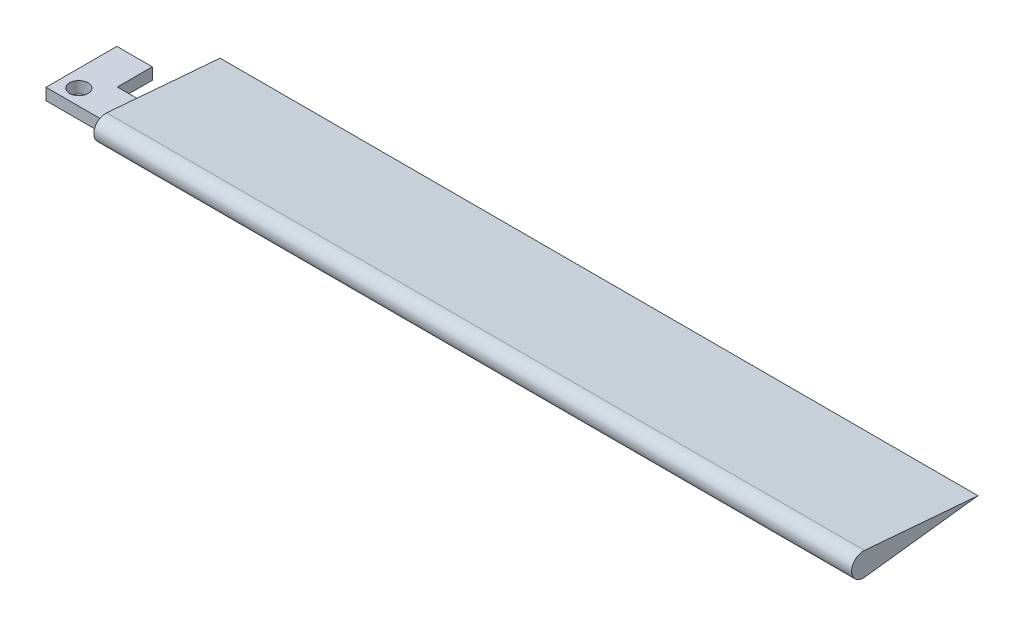
ISO-10303-21;
HEADER;
FILE_DESCRIPTION(('STEP AP214'),'2;1');
FILE_NAME('part.step','',(''),(''),'','','');
FILE_SCHEMA(('AUTOMOTIVE_DESIGN { 1 0 10303 214 1 1 1 1 }'));
ENDSEC;
DATA;
#1=APPLICATION_CONTEXT('core data for automotive mechanical design processes');
#2=APPLICATION_PROTOCOL_DEFINITION('international standard','automotive_design',2000,#1);
#3=PRODUCT_CONTEXT('',#1,'mechanical');
#4=PRODUCT('Part','Part','',(#3));
#5=PRODUCT_RELATED_PRODUCT_CATEGORY('part','',(#4));
#6=PRODUCT_DEFINITION_FORMATION('','',#4);
#7=PRODUCT_DEFINITION_CONTEXT('part definition',#1,'design');
#8=PRODUCT_DEFINITION('design','',#6,#7);
#9=PRODUCT_DEFINITION_SHAPE('','',#8);
#10=(LENGTH_UNIT() NAMED_UNIT(*) SI_UNIT(.MILLI.,.METRE.));
#11=(NAMED_UNIT(*) PLANE_ANGLE_UNIT() SI_UNIT($,.RADIAN.));
#12=(NAMED_UNIT(*) SI_UNIT($,.STERADIAN.) SOLID_ANGLE_UNIT());
#13=UNCERTAINTY_MEASURE_WITH_UNIT(LENGTH_MEASURE(1.E-05),#10,'distance_accuracy_value','');
#14=(GEOMETRIC_REPRESENTATION_CONTEXT(3) GLOBAL_UNCERTAINTY_ASSIGNED_CONTEXT((#13)) GLOBAL_UNIT_ASSIGNED_CONTEXT((#10,
#11,#12)) REPRESENTATION_CONTEXT('',''));
#15=CARTESIAN_POINT('',(0.,0.,0.));
#16=DIRECTION('',(0.,0.,1.));
#17=DIRECTION('',(1.,0.,0.));
#18=AXIS2_PLACEMENT_3D('',#15,#16,#17);
#19=CARTESIAN_POINT('',(-10.,2.21074085443305,14.5472498082597));
#20=DIRECTION('',(0.,0.,1.));
#21=DIRECTION('',(1.,0.,0.));
#22=AXIS2_PLACEMENT_3D('',#19,#20,#21);
#23=PLANE('',#22);
#24=DIRECTION('',(0.,-1.,0.));
#25=VECTOR('',#24,1.);
#26=CARTESIAN_POINT('',(-3.92233865415842,2.21074085443305,14.5472498082597));
#27=LINE('',#26,#25);
#28=CARTESIAN_POINT('',(-3.92233865415842,2.21074085443305,14.5472498082597));
#29=VERTEX_POINT('',#28);
#30=CARTESIAN_POINT('',(-3.92233865415842,0.210740854433052,14.5472498082597));
#31=VERTEX_POINT('',#30);
#32=EDGE_CURVE('E127',#29,#31,#27,.T.);
#33=ORIENTED_EDGE('',*,*,#32,.F.);
#34=DIRECTION('',(1.,0.,0.));
#35=VECTOR('',#34,1.);
#36=CARTESIAN_POINT('',(-10.,2.21074085443305,14.5472498082597));
#37=LINE('',#36,#35);
#38=CARTESIAN_POINT('',(0.,2.21074085443305,14.5472498082597));
#39=VERTEX_POINT('',#38);
#40=EDGE_CURVE('E145',#29,#39,#37,.T.);
#41=ORIENTED_EDGE('',*,*,#40,.T.);
#42=DIRECTION('',(0.,-1.,0.));
#43=VECTOR('',#42,1.);
#44=CARTESIAN_POINT('',(0.,2.21074085443305,14.5472498082597));
#45=LINE('',#44,#43);
#46=CARTESIAN_POINT('',(0.,0.210740854433052,14.5472498082597));
#47=VERTEX_POINT('',#46);
#48=EDGE_CURVE('E131',#39,#47,#45,.T.);
#49=ORIENTED_EDGE('',*,*,#48,.T.);
#50=DIRECTION('',(1.,0.,0.));
#51=VECTOR('',#50,1.);
#52=CARTESIAN_POINT('',(-10.,0.210740854433052,14.5472498082597));
#53=LINE('',#52,#51);
#54=EDGE_CURVE('E53',#31,#47,#53,.T.);
#55=ORIENTED_EDGE('',*,*,#54,.F.);
#56=EDGE_LOOP('',(#33,#41,#49,#55));
#57=FACE_BOUND('',#56,.T.);
#58=ADVANCED_FACE('F38',(#57),#23,.F.);
#59=CARTESIAN_POINT('',(0.,1.21074085443305,20.4986697510022));
#60=DIRECTION('',(1.,0.,0.));
#61=DIRECTION('',(0.,0.,-1.));
#62=AXIS2_PLACEMENT_3D('',#59,#60,#61);
#63=PLANE('',#62);
#64=DIRECTION('',(0.,0.122034025608357,-0.992525917341114));
#65=VECTOR('',#64,1.);
#66=CARTESIAN_POINT('',(0.,-0.789259145566949,20.2941629097624));
#67=LINE('',#66,#65);
#68=CARTESIAN_POINT('',(0.,-0.789259145566948,20.2941629097624));
#69=VERTEX_POINT('',#68);
#70=CARTESIAN_POINT('',(0.,1.60318490389136,0.835960879317459));
#71=VERTEX_POINT('',#70);
#72=EDGE_CURVE('E159',#69,#71,#67,.T.);
#73=ORIENTED_EDGE('',*,*,#72,.F.);
#74=CARTESIAN_POINT('',(0.,1.21074085443305,20.4986697510022));
#75=DIRECTION('',(1.,0.,0.));
#76=DIRECTION('',(0.,0.,-1.));
#77=AXIS2_PLACEMENT_3D('',#74,#75,#76);
#78=CIRCLE('',#77,2.01042857324349);
#79=CARTESIAN_POINT('',(0.,3.21074085443305,20.2941629097624));
#80=VERTEX_POINT('',#79);
#81=EDGE_CURVE('E164',#80,#69,#78,.T.);
#82=ORIENTED_EDGE('',*,*,#81,.F.);
#83=DIRECTION('',(0.,0.0823353454413247,0.996604681351165));
#84=VECTOR('',#83,1.);
#85=CARTESIAN_POINT('',(0.,1.60318490389136,0.835960879317459));
#86=LINE('',#85,#84);
#87=EDGE_CURVE('E171',#71,#80,#86,.T.);
#88=ORIENTED_EDGE('',*,*,#87,.F.);
#89=EDGE_LOOP('',(#73,#82,#88));
#90=FACE_BOUND('',#89,.T.);
#91=ORIENTED_EDGE('',*,*,#48,.F.);
#92=DIRECTION('',(0.,0.,-1.));
#93=VECTOR('',#92,1.);
#94=CARTESIAN_POINT('',(0.,2.21074085443305,14.5472498082597));
#95=LINE('',#94,#93);
#96=CARTESIAN_POINT('',(0.,2.21074085443305,20.7032544626715));
#97=VERTEX_POINT('',#96);
#98=EDGE_CURVE('E142',#97,#39,#95,.T.);
#99=ORIENTED_EDGE('',*,*,#98,.F.);
#100=DIRECTION('',(0.,1.,0.));
#101=VECTOR('',#100,1.);
#102=CARTESIAN_POINT('',(0.,2.21074085443305,20.7032544626715));
#103=LINE('',#102,#101);
#104=CARTESIAN_POINT('',(0.,0.210740854433052,20.7032544626715));
#105=VERTEX_POINT('',#104);
#106=EDGE_CURVE('E60',#105,#97,#103,.T.);
#107=ORIENTED_EDGE('',*,*,#106,.F.);
#108=DIRECTION('',(0.,0.,1.));
#109=VECTOR('',#108,1.);
#110=CARTESIAN_POINT('',(0.,0.210740854433052,14.5472498082597));
#111=LINE('',#110,#109);
#112=EDGE_CURVE('E135',#47,#105,#111,.T.);
#113=ORIENTED_EDGE('',*,*,#112,.F.);
#114=EDGE_LOOP('',(#91,#99,#107,#113));
#115=FACE_BOUND('',#114,.T.);
#116=ADVANCED_FACE('F185',(#90,#115),#63,.F.);
#117=CARTESIAN_POINT('',(130.,-0.789259145566949,20.2941629097624));
#118=DIRECTION('',(0.,0.992525917341114,0.122034025608357));
#119=DIRECTION('',(0.,-0.122034025608357,0.992525917341114));
#120=AXIS2_PLACEMENT_3D('',#117,#118,#119);
#121=PLANE('',#120);
#122=ORIENTED_EDGE('',*,*,#72,.T.);
#123=DIRECTION('',(-1.,0.,0.));
#124=VECTOR('',#123,1.);
#125=CARTESIAN_POINT('',(130.,1.60318490389136,0.835960879317459));
#126=LINE('',#125,#124);
#127=CARTESIAN_POINT('',(130.,1.60318490389136,0.835960879317459));
#128=VERTEX_POINT('',#127);
#129=EDGE_CURVE('E11',#128,#71,#126,.T.);
#130=ORIENTED_EDGE('',*,*,#129,.F.);
#131=DIRECTION('',(0.,0.122034025608357,-0.992525917341114));
#132=VECTOR('',#131,1.);
#133=CARTESIAN_POINT('',(130.,-0.789259145566949,20.2941629097624));
#134=LINE('',#133,#132);
#135=CARTESIAN_POINT('',(130.,-0.789259145566948,20.2941629097624));
#136=VERTEX_POINT('',#135);
#137=EDGE_CURVE('E160',#136,#128,#134,.T.);
#138=ORIENTED_EDGE('',*,*,#137,.F.);
#139=DIRECTION('',(-1.,0.,0.));
#140=VECTOR('',#139,1.);
#141=CARTESIAN_POINT('',(130.,-0.789259145566948,20.2941629097624));
#142=LINE('',#141,#140);
#143=EDGE_CURVE('E168',#136,#69,#142,.T.);
#144=ORIENTED_EDGE('',*,*,#143,.T.);
#145=EDGE_LOOP('',(#122,#130,#138,#144));
#146=FACE_BOUND('',#145,.T.);
#147=ADVANCED_FACE('F40',(#146),#121,.F.);
#148=CARTESIAN_POINT('',(130.,1.60318490389136,0.835960879317459));
#149=DIRECTION('',(0.,-0.996604681351165,0.0823353454413247));
#150=DIRECTION('',(0.,-0.0823353454413247,-0.996604681351165));
#151=AXIS2_PLACEMENT_3D('',#148,#149,#150);
#152=PLANE('',#151);
#153=ORIENTED_EDGE('',*,*,#87,.T.);
#154=DIRECTION('',(-1.,0.,0.));
#155=VECTOR('',#154,1.);
#156=CARTESIAN_POINT('',(130.,3.21074085443305,20.2941629097624));
#157=LINE('',#156,#155);
#158=CARTESIAN_POINT('',(130.,3.21074085443305,20.2941629097624));
#159=VERTEX_POINT('',#158);
#160=EDGE_CURVE('E46',#159,#80,#157,.T.);
#161=ORIENTED_EDGE('',*,*,#160,.F.);
#162=DIRECTION('',(0.,0.0823353454413247,0.996604681351165));
#163=VECTOR('',#162,1.);
#164=CARTESIAN_POINT('',(130.,1.60318490389136,0.835960879317459));
#165=LINE('',#164,#163);
#166=EDGE_CURVE('E163',#128,#159,#165,.T.);
#167=ORIENTED_EDGE('',*,*,#166,.F.);
#168=ORIENTED_EDGE('',*,*,#129,.T.);
#169=EDGE_LOOP('',(#153,#161,#167,#168));
#170=FACE_BOUND('',#169,.T.);
#171=ADVANCED_FACE('F191',(#170),#152,.F.);
#172=CARTESIAN_POINT('',(130.,1.21074085443305,20.4986697510022));
#173=DIRECTION('',(-1.,0.,0.));
#174=DIRECTION('',(0.,0.,1.));
#175=AXIS2_PLACEMENT_3D('',#172,#173,#174);
#176=CYLINDRICAL_SURFACE('',#175,2.01042857324349);
#177=ORIENTED_EDGE('',*,*,#81,.T.);
#178=ORIENTED_EDGE('',*,*,#143,.F.);
#179=CARTESIAN_POINT('',(130.,1.21074085443305,20.4986697510022));
#180=DIRECTION('',(1.,0.,0.));
#181=DIRECTION('',(0.,0.,-1.));
#182=AXIS2_PLACEMENT_3D('',#179,#180,#181);
#183=CIRCLE('',#182,2.01042857324349);
#184=EDGE_CURVE('E166',#159,#136,#183,.T.);
#185=ORIENTED_EDGE('',*,*,#184,.F.);
#186=ORIENTED_EDGE('',*,*,#160,.T.);
#187=EDGE_LOOP('',(#177,#178,#185,#186));
#188=FACE_BOUND('',#187,.T.);
#189=ADVANCED_FACE('F180',(#188),#176,.T.);
#190=CARTESIAN_POINT('',(130.,1.21074085443305,20.4986697510022));
#191=DIRECTION('',(1.,0.,0.));
#192=DIRECTION('',(0.,0.,-1.));
#193=AXIS2_PLACEMENT_3D('',#190,#191,#192);
#194=PLANE('',#193);
#195=ORIENTED_EDGE('',*,*,#137,.T.);
#196=ORIENTED_EDGE('',*,*,#166,.T.);
#197=ORIENTED_EDGE('',*,*,#184,.T.);
#198=EDGE_LOOP('',(#195,#196,#197));
#199=FACE_BOUND('',#198,.T.);
#200=ADVANCED_FACE('F190',(#199),#194,.T.);
#201=CARTESIAN_POINT('',(-10.,0.210740854433052,14.5472498082597));
#202=DIRECTION('',(0.,1.,0.));
#203=DIRECTION('',(0.,0.,1.));
#204=AXIS2_PLACEMENT_3D('',#201,#202,#203);
#205=PLANE('',#204);
#206=CARTESIAN_POINT('',(-7.05741101857545,0.210740854433052,18.0170903993996));
#207=DIRECTION('',(0.,1.,0.));
#208=DIRECTION('',(0.,0.,1.));
#209=AXIS2_PLACEMENT_3D('',#206,#207,#208);
#210=CIRCLE('',#209,1.5875);
#211=CARTESIAN_POINT('',(-7.05741101857545,0.210740854433052,19.6045903993996));
#212=VERTEX_POINT('',#211);
#213=EDGE_CURVE('E221',#212,#212,#210,.T.);
#214=ORIENTED_EDGE('',*,*,#213,.T.);
#215=EDGE_LOOP('',(#214));
#216=FACE_BOUND('',#215,.T.);
#217=ORIENTED_EDGE('',*,*,#112,.T.);
#218=DIRECTION('',(1.,0.,0.));
#219=VECTOR('',#218,1.);
#220=CARTESIAN_POINT('',(-10.,0.210740854433052,20.7032544626715));
#221=LINE('',#220,#219);
#222=CARTESIAN_POINT('',(-10.,0.210740854433052,20.7032544626715));
#223=VERTEX_POINT('',#222);
#224=EDGE_CURVE('E155',#223,#105,#221,.T.);
#225=ORIENTED_EDGE('',*,*,#224,.F.);
#226=DIRECTION('',(0.,0.,1.));
#227=VECTOR('',#226,1.);
#228=CARTESIAN_POINT('',(-10.,0.210740854433052,14.5472498082597));
#229=LINE('',#228,#227);
#230=CARTESIAN_POINT('',(-10.,0.210740854433052,8.54724980825972));
#231=VERTEX_POINT('',#230);
#232=EDGE_CURVE('E114',#231,#223,#229,.T.);
#233=ORIENTED_EDGE('',*,*,#232,.F.);
#234=DIRECTION('',(-1.,0.,0.));
#235=VECTOR('',#234,1.);
#236=CARTESIAN_POINT('',(-3.92233865415842,0.210740854433052,8.54724980825972));
#237=LINE('',#236,#235);
#238=CARTESIAN_POINT('',(-3.92233865415842,0.210740854433052,8.54724980825972));
#239=VERTEX_POINT('',#238);
#240=EDGE_CURVE('E107',#239,#231,#237,.T.);
#241=ORIENTED_EDGE('',*,*,#240,.F.);
#242=DIRECTION('',(0.,0.,1.));
#243=VECTOR('',#242,1.);
#244=CARTESIAN_POINT('',(-3.92233865415842,0.210740854433052,8.54724980825972));
#245=LINE('',#244,#243);
#246=EDGE_CURVE('E111',#239,#31,#245,.T.);
#247=ORIENTED_EDGE('',*,*,#246,.T.);
#248=ORIENTED_EDGE('',*,*,#54,.T.);
#249=EDGE_LOOP('',(#217,#225,#233,#241,#247,#248));
#250=FACE_BOUND('',#249,.T.);
#251=ADVANCED_FACE('F109',(#216,#250),#205,.F.);
#252=CARTESIAN_POINT('',(-10.,2.21074085443305,20.7032544626715));
#253=DIRECTION('',(0.,0.,-1.));
#254=DIRECTION('',(-1.,0.,0.));
#255=AXIS2_PLACEMENT_3D('',#252,#253,#254);
#256=PLANE('',#255);
#257=ORIENTED_EDGE('',*,*,#106,.T.);
#258=DIRECTION('',(1.,0.,0.));
#259=VECTOR('',#258,1.);
#260=CARTESIAN_POINT('',(-10.,2.21074085443305,20.7032544626715));
#261=LINE('',#260,#259);
#262=CARTESIAN_POINT('',(-10.,2.21074085443305,20.7032544626715));
#263=VERTEX_POINT('',#262);
#264=EDGE_CURVE('E152',#263,#97,#261,.T.);
#265=ORIENTED_EDGE('',*,*,#264,.F.);
#266=DIRECTION('',(0.,1.,0.));
#267=VECTOR('',#266,1.);
#268=CARTESIAN_POINT('',(-10.,2.21074085443305,20.7032544626715));
#269=LINE('',#268,#267);
#270=EDGE_CURVE('E141',#223,#263,#269,.T.);
#271=ORIENTED_EDGE('',*,*,#270,.F.);
#272=ORIENTED_EDGE('',*,*,#224,.T.);
#273=EDGE_LOOP('',(#257,#265,#271,#272));
#274=FACE_BOUND('',#273,.T.);
#275=ADVANCED_FACE('F212',(#274),#256,.F.);
#276=CARTESIAN_POINT('',(-10.,2.21074085443305,14.5472498082597));
#277=DIRECTION('',(0.,-1.,0.));
#278=DIRECTION('',(0.,0.,-1.));
#279=AXIS2_PLACEMENT_3D('',#276,#277,#278);
#280=PLANE('',#279);
#281=CARTESIAN_POINT('',(-7.05741101857545,2.21074085443305,18.0170903993996));
#282=DIRECTION('',(0.,1.,0.));
#283=DIRECTION('',(0.,0.,1.));
#284=AXIS2_PLACEMENT_3D('',#281,#282,#283);
#285=CIRCLE('',#284,1.5875);
#286=CARTESIAN_POINT('',(-7.05741101857545,2.21074085443305,19.6045903993996));
#287=VERTEX_POINT('',#286);
#288=EDGE_CURVE('E223',#287,#287,#285,.T.);
#289=ORIENTED_EDGE('',*,*,#288,.F.);
#290=EDGE_LOOP('',(#289));
#291=FACE_BOUND('',#290,.T.);
#292=ORIENTED_EDGE('',*,*,#98,.T.);
#293=ORIENTED_EDGE('',*,*,#40,.F.);
#294=DIRECTION('',(0.,0.,1.));
#295=VECTOR('',#294,1.);
#296=CARTESIAN_POINT('',(-3.92233865415842,2.21074085443305,8.54724980825972));
#297=LINE('',#296,#295);
#298=CARTESIAN_POINT('',(-3.92233865415842,2.21074085443305,8.54724980825972));
#299=VERTEX_POINT('',#298);
#300=EDGE_CURVE('E132',#299,#29,#297,.T.);
#301=ORIENTED_EDGE('',*,*,#300,.F.);
#302=DIRECTION('',(1.,0.,0.));
#303=VECTOR('',#302,1.);
#304=CARTESIAN_POINT('',(-3.92233865415842,2.21074085443305,8.54724980825972));
#305=LINE('',#304,#303);
#306=CARTESIAN_POINT('',(-10.,2.21074085443305,8.54724980825972));
#307=VERTEX_POINT('',#306);
#308=EDGE_CURVE('E124',#307,#299,#305,.T.);
#309=ORIENTED_EDGE('',*,*,#308,.F.);
#310=DIRECTION('',(0.,0.,-1.));
#311=VECTOR('',#310,1.);
#312=CARTESIAN_POINT('',(-10.,2.21074085443305,14.5472498082597));
#313=LINE('',#312,#311);
#314=EDGE_CURVE('E144',#263,#307,#313,.T.);
#315=ORIENTED_EDGE('',*,*,#314,.F.);
#316=ORIENTED_EDGE('',*,*,#264,.T.);
#317=EDGE_LOOP('',(#292,#293,#301,#309,#315,#316));
#318=FACE_BOUND('',#317,.T.);
#319=ADVANCED_FACE('F217',(#291,#318),#280,.F.);
#320=CARTESIAN_POINT('',(-10.,0.,0.));
#321=DIRECTION('',(-1.,0.,0.));
#322=DIRECTION('',(0.,0.,1.));
#323=AXIS2_PLACEMENT_3D('',#320,#321,#322);
#324=PLANE('',#323);
#325=ORIENTED_EDGE('',*,*,#314,.T.);
#326=DIRECTION('',(0.,1.,0.));
#327=VECTOR('',#326,1.);
#328=CARTESIAN_POINT('',(-10.,2.21074085443305,8.54724980825972));
#329=LINE('',#328,#327);
#330=EDGE_CURVE('E118',#231,#307,#329,.T.);
#331=ORIENTED_EDGE('',*,*,#330,.F.);
#332=ORIENTED_EDGE('',*,*,#232,.T.);
#333=ORIENTED_EDGE('',*,*,#270,.T.);
#334=EDGE_LOOP('',(#325,#331,#332,#333));
#335=FACE_BOUND('',#334,.T.);
#336=ADVANCED_FACE('F236',(#335),#324,.T.);
#337=CARTESIAN_POINT('',(-3.92233865415842,2.21074085443305,8.54724980825972));
#338=DIRECTION('',(-1.,0.,0.));
#339=DIRECTION('',(0.,0.,1.));
#340=AXIS2_PLACEMENT_3D('',#337,#338,#339);
#341=PLANE('',#340);
#342=ORIENTED_EDGE('',*,*,#32,.T.);
#343=ORIENTED_EDGE('',*,*,#246,.F.);
#344=DIRECTION('',(0.,-1.,0.));
#345=VECTOR('',#344,1.);
#346=CARTESIAN_POINT('',(-3.92233865415842,2.21074085443305,8.54724980825972));
#347=LINE('',#346,#345);
#348=EDGE_CURVE('E119',#299,#239,#347,.T.);
#349=ORIENTED_EDGE('',*,*,#348,.F.);
#350=ORIENTED_EDGE('',*,*,#300,.T.);
#351=EDGE_LOOP('',(#342,#343,#349,#350));
#352=FACE_BOUND('',#351,.T.);
#353=ADVANCED_FACE('F129',(#352),#341,.F.);
#354=CARTESIAN_POINT('',(0.,0.,8.54724980825972));
#355=DIRECTION('',(0.,0.,-1.));
#356=DIRECTION('',(-1.,0.,0.));
#357=AXIS2_PLACEMENT_3D('',#354,#355,#356);
#358=PLANE('',#357);
#359=ORIENTED_EDGE('',*,*,#348,.T.);
#360=ORIENTED_EDGE('',*,*,#240,.T.);
#361=ORIENTED_EDGE('',*,*,#330,.T.);
#362=ORIENTED_EDGE('',*,*,#308,.T.);
#363=EDGE_LOOP('',(#359,#360,#361,#362));
#364=FACE_BOUND('',#363,.T.);
#365=ADVANCED_FACE('F122',(#364),#358,.T.);
#366=CARTESIAN_POINT('',(-7.05741101857545,-0.799687718810443,18.0170903993996));
#367=DIRECTION('',(0.,1.,0.));
#368=DIRECTION('',(0.,0.,1.));
#369=AXIS2_PLACEMENT_3D('',#366,#367,#368);
#370=CYLINDRICAL_SURFACE('',#369,1.5875);
#371=ORIENTED_EDGE('',*,*,#288,.T.);
#372=EDGE_LOOP('',(#371));
#373=FACE_BOUND('',#372,.T.);
#374=ORIENTED_EDGE('',*,*,#213,.F.);
#375=EDGE_LOOP('',(#374));
#376=FACE_BOUND('',#375,.T.);
#377=ADVANCED_FACE('F249',(#373,#376),#370,.F.);
#378=CLOSED_SHELL('',(#58,#116,#147,#171,#189,#200,#251,#275,#319,#336,#353,#365,#377));
#379=MANIFOLD_SOLID_BREP('B2',#378);
#380=ADVANCED_BREP_SHAPE_REPRESENTATION('',(#18,#379),#14);
#381=SHAPE_DEFINITION_REPRESENTATION(#9,#380);
ENDSEC;
END-ISO-10303-21;
